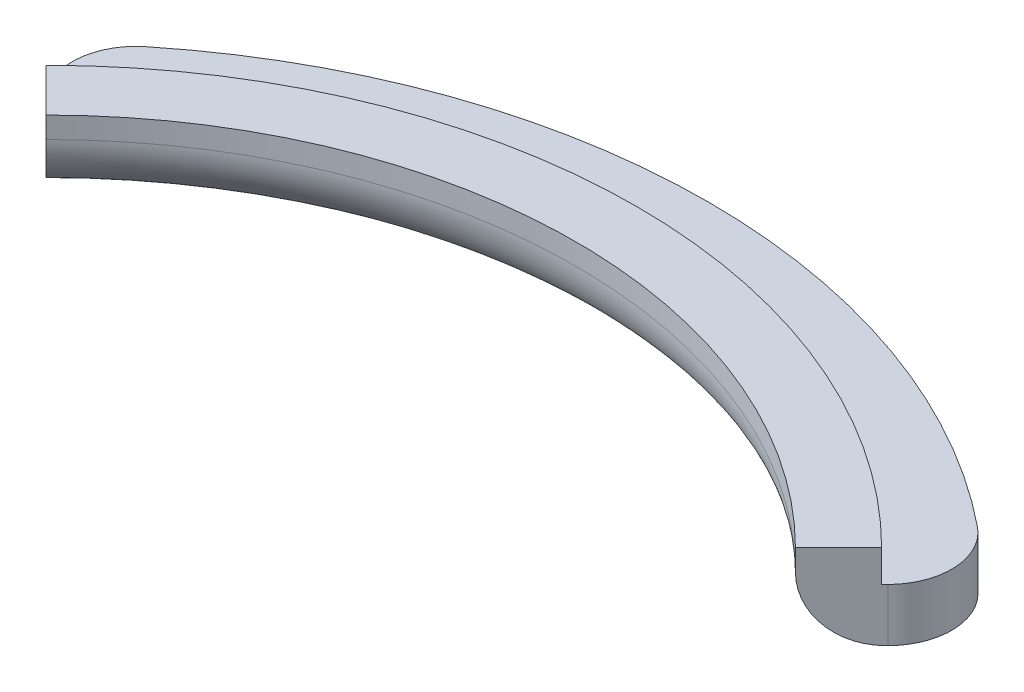
ISO-10303-21;
HEADER;
FILE_DESCRIPTION(('STEP AP214'),'2;1');
FILE_NAME('part.step','',(''),(''),'','','');
FILE_SCHEMA(('AUTOMOTIVE_DESIGN { 1 0 10303 214 1 1 1 1 }'));
ENDSEC;
DATA;
#1=APPLICATION_CONTEXT('core data for automotive mechanical design processes');
#2=APPLICATION_PROTOCOL_DEFINITION('international standard','automotive_design',2000,#1);
#3=PRODUCT_CONTEXT('',#1,'mechanical');
#4=PRODUCT('Part','Part','',(#3));
#5=PRODUCT_RELATED_PRODUCT_CATEGORY('part','',(#4));
#6=PRODUCT_DEFINITION_FORMATION('','',#4);
#7=PRODUCT_DEFINITION_CONTEXT('part definition',#1,'design');
#8=PRODUCT_DEFINITION('design','',#6,#7);
#9=PRODUCT_DEFINITION_SHAPE('','',#8);
#10=(LENGTH_UNIT() NAMED_UNIT(*) SI_UNIT(.MILLI.,.METRE.));
#11=(NAMED_UNIT(*) PLANE_ANGLE_UNIT() SI_UNIT($,.RADIAN.));
#12=(NAMED_UNIT(*) SI_UNIT($,.STERADIAN.) SOLID_ANGLE_UNIT());
#13=UNCERTAINTY_MEASURE_WITH_UNIT(LENGTH_MEASURE(1.E-05),#10,'distance_accuracy_value','');
#14=(GEOMETRIC_REPRESENTATION_CONTEXT(3) GLOBAL_UNCERTAINTY_ASSIGNED_CONTEXT((#13)) GLOBAL_UNIT_ASSIGNED_CONTEXT((#10,
#11,#12)) REPRESENTATION_CONTEXT('',''));
#15=CARTESIAN_POINT('',(0.,0.,0.));
#16=DIRECTION('',(0.,0.,1.));
#17=DIRECTION('',(1.,0.,0.));
#18=AXIS2_PLACEMENT_3D('',#15,#16,#17);
#19=CARTESIAN_POINT('',(0.,2.032,0.));
#20=DIRECTION('',(0.,-1.,0.));
#21=DIRECTION('',(0.,0.,-1.));
#22=AXIS2_PLACEMENT_3D('',#19,#20,#21);
#23=CYLINDRICAL_SURFACE('',#22,12.7);
#24=DIRECTION('',(0.,-1.,0.));
#25=VECTOR('',#24,1.);
#26=CARTESIAN_POINT('',(-8.98025612106917,2.032,-8.98025612106914));
#27=LINE('',#26,#25);
#28=CARTESIAN_POINT('',(-8.98025612106917,2.032,-8.98025612106914));
#29=VERTEX_POINT('',#28);
#30=CARTESIAN_POINT('',(-8.98025612106917,1.524,-8.98025612106914));
#31=VERTEX_POINT('',#30);
#32=EDGE_CURVE('E156',#29,#31,#27,.T.);
#33=ORIENTED_EDGE('',*,*,#32,.T.);
#34=CARTESIAN_POINT('',(0.,1.524,0.));
#35=DIRECTION('',(0.,1.,0.));
#36=DIRECTION('',(0.,0.,1.));
#37=AXIS2_PLACEMENT_3D('',#34,#35,#36);
#38=CIRCLE('',#37,12.7);
#39=CARTESIAN_POINT('',(8.98025612106917,1.524,-8.98025612106914));
#40=VERTEX_POINT('',#39);
#41=EDGE_CURVE('E172',#31,#40,#38,.F.);
#42=ORIENTED_EDGE('',*,*,#41,.T.);
#43=DIRECTION('',(0.,-1.,0.));
#44=VECTOR('',#43,1.);
#45=CARTESIAN_POINT('',(8.98025612106917,2.032,-8.98025612106914));
#46=LINE('',#45,#44);
#47=CARTESIAN_POINT('',(8.98025612106917,2.032,-8.98025612106914));
#48=VERTEX_POINT('',#47);
#49=EDGE_CURVE('E168',#48,#40,#46,.T.);
#50=ORIENTED_EDGE('',*,*,#49,.F.);
#51=CARTESIAN_POINT('',(0.,2.032,0.));
#52=DIRECTION('',(0.,-1.,0.));
#53=DIRECTION('',(0.,0.,1.));
#54=AXIS2_PLACEMENT_3D('',#51,#52,#53);
#55=CIRCLE('',#54,12.7);
#56=EDGE_CURVE('E145',#29,#48,#55,.T.);
#57=ORIENTED_EDGE('',*,*,#56,.F.);
#58=EDGE_LOOP('',(#33,#42,#50,#57));
#59=FACE_BOUND('',#58,.T.);
#60=ADVANCED_FACE('F39',(#59),#23,.F.);
#61=CARTESIAN_POINT('',(8.98025612106917,2.032,-8.98025612106914));
#62=DIRECTION('',(-0.707106781186546,0.,-0.707106781186549));
#63=DIRECTION('',(-0.707106781186549,0.,0.707106781186546));
#64=AXIS2_PLACEMENT_3D('',#61,#62,#63);
#65=PLANE('',#64);
#66=DIRECTION('',(0.707106781186549,0.,-0.707106781186546));
#67=VECTOR('',#66,1.);
#68=CARTESIAN_POINT('',(8.98025612106917,0.,-8.98025612106914));
#69=LINE('',#68,#67);
#70=CARTESIAN_POINT('',(10.0578868555975,0.,-10.0578868555974));
#71=VERTEX_POINT('',#70);
#72=CARTESIAN_POINT('',(10.0903078496149,0.,-10.0903078496149));
#73=VERTEX_POINT('',#72);
#74=EDGE_CURVE('E143',#71,#73,#69,.T.);
#75=ORIENTED_EDGE('',*,*,#74,.T.);
#76=DIRECTION('',(0.,-1.,0.));
#77=VECTOR('',#76,1.);
#78=CARTESIAN_POINT('',(10.0903078496149,2.032,-10.0903078496149));
#79=LINE('',#78,#77);
#80=CARTESIAN_POINT('',(10.0903078496149,1.27,-10.0903078496149));
#81=VERTEX_POINT('',#80);
#82=EDGE_CURVE('E63',#73,#81,#79,.F.);
#83=ORIENTED_EDGE('',*,*,#82,.T.);
#84=DIRECTION('',(0.707106781186549,0.,-0.707106781186546));
#85=VECTOR('',#84,1.);
#86=CARTESIAN_POINT('',(10.0129855749921,1.27,-10.0129855749921));
#87=LINE('',#86,#85);
#88=CARTESIAN_POINT('',(10.0129855749921,1.27,-10.0129855749921));
#89=VERTEX_POINT('',#88);
#90=EDGE_CURVE('E127',#89,#81,#87,.T.);
#91=ORIENTED_EDGE('',*,*,#90,.F.);
#92=DIRECTION('',(0.,1.,0.));
#93=VECTOR('',#92,1.);
#94=CARTESIAN_POINT('',(10.0129855749921,1.27,-10.0129855749921));
#95=LINE('',#94,#93);
#96=CARTESIAN_POINT('',(10.0129855749921,2.032,-10.0129855749921));
#97=VERTEX_POINT('',#96);
#98=EDGE_CURVE('E114',#89,#97,#95,.T.);
#99=ORIENTED_EDGE('',*,*,#98,.T.);
#100=DIRECTION('',(0.707106781186549,0.,-0.707106781186546));
#101=VECTOR('',#100,1.);
#102=CARTESIAN_POINT('',(8.98025612106917,2.032,-8.98025612106914));
#103=LINE('',#102,#101);
#104=EDGE_CURVE('E149',#48,#97,#103,.T.);
#105=ORIENTED_EDGE('',*,*,#104,.F.);
#106=ORIENTED_EDGE('',*,*,#49,.T.);
#107=CARTESIAN_POINT('',(10.0578868555975,1.524,-10.0578868555974));
#108=DIRECTION('',(-0.707106781186546,0.,-0.707106781186549));
#109=DIRECTION('',(-0.707106781186549,0.,0.707106781186546));
#110=AXIS2_PLACEMENT_3D('',#107,#108,#109);
#111=CIRCLE('',#110,1.524);
#112=EDGE_CURVE('E176',#40,#71,#111,.F.);
#113=ORIENTED_EDGE('',*,*,#112,.T.);
#114=EDGE_LOOP('',(#75,#83,#91,#99,#105,#106,#113));
#115=FACE_BOUND('',#114,.T.);
#116=ADVANCED_FACE('F131',(#115),#65,.F.);
#117=CARTESIAN_POINT('',(0.,2.032,0.));
#118=DIRECTION('',(0.,-1.,0.));
#119=DIRECTION('',(0.,0.,-1.));
#120=AXIS2_PLACEMENT_3D('',#117,#118,#119);
#121=CYLINDRICAL_SURFACE('',#120,15.875);
#122=CARTESIAN_POINT('',(0.,1.27,0.));
#123=DIRECTION('',(0.,1.,0.));
#124=DIRECTION('',(0.,0.,1.));
#125=AXIS2_PLACEMENT_3D('',#122,#123,#124);
#126=CIRCLE('',#125,15.875);
#127=CARTESIAN_POINT('',(9.96977556978608,1.27,-12.3539143629902));
#128=VERTEX_POINT('',#127);
#129=CARTESIAN_POINT('',(-9.96977556978608,1.27,-12.3539143629902));
#130=VERTEX_POINT('',#129);
#131=EDGE_CURVE('E133',#128,#130,#126,.T.);
#132=ORIENTED_EDGE('',*,*,#131,.F.);
#133=DIRECTION('',(0.,-1.,0.));
#134=VECTOR('',#133,1.);
#135=CARTESIAN_POINT('',(9.96977556978608,2.032,-12.3539143629902));
#136=LINE('',#135,#134);
#137=CARTESIAN_POINT('',(9.96977556978608,0.,-12.3539143629902));
#138=VERTEX_POINT('',#137);
#139=EDGE_CURVE('E189',#128,#138,#136,.T.);
#140=ORIENTED_EDGE('',*,*,#139,.T.);
#141=CARTESIAN_POINT('',(0.,0.,0.));
#142=DIRECTION('',(0.,1.,0.));
#143=DIRECTION('',(0.,0.,1.));
#144=AXIS2_PLACEMENT_3D('',#141,#142,#143);
#145=CIRCLE('',#144,15.875);
#146=CARTESIAN_POINT('',(-9.96977556978608,0.,-12.3539143629902));
#147=VERTEX_POINT('',#146);
#148=EDGE_CURVE('E159',#138,#147,#145,.T.);
#149=ORIENTED_EDGE('',*,*,#148,.T.);
#150=DIRECTION('',(0.,-1.,0.));
#151=VECTOR('',#150,1.);
#152=CARTESIAN_POINT('',(-9.96977556978608,2.032,-12.3539143629902));
#153=LINE('',#152,#151);
#154=EDGE_CURVE('E186',#147,#130,#153,.F.);
#155=ORIENTED_EDGE('',*,*,#154,.T.);
#156=EDGE_LOOP('',(#132,#140,#149,#155));
#157=FACE_BOUND('',#156,.T.);
#158=ADVANCED_FACE('F207',(#157),#121,.T.);
#159=CARTESIAN_POINT('',(-8.98025612106917,2.032,-8.98025612106914));
#160=DIRECTION('',(0.707106781186546,0.,-0.707106781186549));
#161=DIRECTION('',(-0.707106781186549,0.,-0.707106781186546));
#162=AXIS2_PLACEMENT_3D('',#159,#160,#161);
#163=PLANE('',#162);
#164=DIRECTION('',(0.707106781186549,0.,0.707106781186547));
#165=VECTOR('',#164,1.);
#166=CARTESIAN_POINT('',(-11.2253201513365,1.27,-11.2253201513364));
#167=LINE('',#166,#165);
#168=CARTESIAN_POINT('',(-10.0903078496149,1.27,-10.0903078496149));
#169=VERTEX_POINT('',#168);
#170=CARTESIAN_POINT('',(-10.0129855749921,1.27,-10.0129855749921));
#171=VERTEX_POINT('',#170);
#172=EDGE_CURVE('E124',#169,#171,#167,.T.);
#173=ORIENTED_EDGE('',*,*,#172,.F.);
#174=DIRECTION('',(0.,-1.,0.));
#175=VECTOR('',#174,1.);
#176=CARTESIAN_POINT('',(-10.0903078496149,2.032,-10.0903078496149));
#177=LINE('',#176,#175);
#178=CARTESIAN_POINT('',(-10.0903078496149,0.,-10.0903078496149));
#179=VERTEX_POINT('',#178);
#180=EDGE_CURVE('E11',#169,#179,#177,.T.);
#181=ORIENTED_EDGE('',*,*,#180,.T.);
#182=DIRECTION('',(0.707106781186549,0.,0.707106781186546));
#183=VECTOR('',#182,1.);
#184=CARTESIAN_POINT('',(-8.98025612106917,0.,-8.98025612106914));
#185=LINE('',#184,#183);
#186=CARTESIAN_POINT('',(-10.0578868555975,0.,-10.0578868555974));
#187=VERTEX_POINT('',#186);
#188=EDGE_CURVE('E150',#179,#187,#185,.T.);
#189=ORIENTED_EDGE('',*,*,#188,.T.);
#190=CARTESIAN_POINT('',(-10.0578868555975,1.524,-10.0578868555974));
#191=DIRECTION('',(0.707106781186546,0.,-0.707106781186549));
#192=DIRECTION('',(-0.707106781186549,0.,-0.707106781186546));
#193=AXIS2_PLACEMENT_3D('',#190,#191,#192);
#194=CIRCLE('',#193,1.524);
#195=EDGE_CURVE('E183',#187,#31,#194,.F.);
#196=ORIENTED_EDGE('',*,*,#195,.T.);
#197=ORIENTED_EDGE('',*,*,#32,.F.);
#198=DIRECTION('',(0.707106781186549,0.,0.707106781186546));
#199=VECTOR('',#198,1.);
#200=CARTESIAN_POINT('',(-8.98025612106917,2.032,-8.98025612106914));
#201=LINE('',#200,#199);
#202=CARTESIAN_POINT('',(-10.0129855749921,2.032,-10.0129855749921));
#203=VERTEX_POINT('',#202);
#204=EDGE_CURVE('E153',#203,#29,#201,.T.);
#205=ORIENTED_EDGE('',*,*,#204,.F.);
#206=DIRECTION('',(0.,1.,0.));
#207=VECTOR('',#206,1.);
#208=CARTESIAN_POINT('',(-10.0129855749921,1.27,-10.0129855749921));
#209=LINE('',#208,#207);
#210=EDGE_CURVE('E123',#171,#203,#209,.T.);
#211=ORIENTED_EDGE('',*,*,#210,.F.);
#212=EDGE_LOOP('',(#173,#181,#189,#196,#197,#205,#211));
#213=FACE_BOUND('',#212,.T.);
#214=ADVANCED_FACE('F225',(#213),#163,.F.);
#215=CARTESIAN_POINT('',(0.,2.032,0.));
#216=DIRECTION('',(0.,1.,0.));
#217=DIRECTION('',(0.,0.,1.));
#218=AXIS2_PLACEMENT_3D('',#215,#216,#217);
#219=PLANE('',#218);
#220=CARTESIAN_POINT('',(0.,2.032,0.));
#221=DIRECTION('',(0.,-1.,0.));
#222=DIRECTION('',(0.,0.,-1.));
#223=AXIS2_PLACEMENT_3D('',#220,#221,#222);
#224=CIRCLE('',#223,14.1605);
#225=EDGE_CURVE('E120',#203,#97,#224,.T.);
#226=ORIENTED_EDGE('',*,*,#225,.F.);
#227=ORIENTED_EDGE('',*,*,#204,.T.);
#228=ORIENTED_EDGE('',*,*,#56,.T.);
#229=ORIENTED_EDGE('',*,*,#104,.T.);
#230=EDGE_LOOP('',(#226,#227,#228,#229));
#231=FACE_BOUND('',#230,.T.);
#232=ADVANCED_FACE('F251',(#231),#219,.T.);
#233=CARTESIAN_POINT('',(0.,0.,0.));
#234=DIRECTION('',(0.,1.,0.));
#235=DIRECTION('',(0.,0.,1.));
#236=AXIS2_PLACEMENT_3D('',#233,#234,#235);
#237=PLANE('',#236);
#238=ORIENTED_EDGE('',*,*,#148,.F.);
#239=CARTESIAN_POINT('',(9.01267711508662,0.,-11.1679385841432));
#240=DIRECTION('',(0.,1.,0.));
#241=DIRECTION('',(0.,0.,1.));
#242=AXIS2_PLACEMENT_3D('',#239,#240,#241);
#243=CIRCLE('',#242,1.524);
#244=EDGE_CURVE('E196',#138,#73,#243,.F.);
#245=ORIENTED_EDGE('',*,*,#244,.T.);
#246=ORIENTED_EDGE('',*,*,#74,.F.);
#247=CARTESIAN_POINT('',(0.,0.,0.));
#248=DIRECTION('',(0.,1.,0.));
#249=DIRECTION('',(0.,0.,1.));
#250=AXIS2_PLACEMENT_3D('',#247,#248,#249);
#251=CIRCLE('',#250,14.224);
#252=EDGE_CURVE('E179',#71,#187,#251,.T.);
#253=ORIENTED_EDGE('',*,*,#252,.T.);
#254=ORIENTED_EDGE('',*,*,#188,.F.);
#255=CARTESIAN_POINT('',(-9.01267711508662,0.,-11.1679385841432));
#256=DIRECTION('',(0.,1.,0.));
#257=DIRECTION('',(0.,0.,1.));
#258=AXIS2_PLACEMENT_3D('',#255,#256,#257);
#259=CIRCLE('',#258,1.524);
#260=EDGE_CURVE('E193',#179,#147,#259,.F.);
#261=ORIENTED_EDGE('',*,*,#260,.T.);
#262=EDGE_LOOP('',(#238,#245,#246,#253,#254,#261));
#263=FACE_BOUND('',#262,.T.);
#264=ADVANCED_FACE('F213',(#263),#237,.F.);
#265=CARTESIAN_POINT('',(0.,1.27,0.));
#266=DIRECTION('',(0.,1.,0.));
#267=DIRECTION('',(0.,0.,1.));
#268=AXIS2_PLACEMENT_3D('',#265,#266,#267);
#269=CYLINDRICAL_SURFACE('',#268,14.1605);
#270=ORIENTED_EDGE('',*,*,#225,.T.);
#271=ORIENTED_EDGE('',*,*,#98,.F.);
#272=CARTESIAN_POINT('',(0.,1.27,0.));
#273=DIRECTION('',(0.,-1.,0.));
#274=DIRECTION('',(0.,0.,-1.));
#275=AXIS2_PLACEMENT_3D('',#272,#273,#274);
#276=CIRCLE('',#275,14.1605);
#277=EDGE_CURVE('E117',#171,#89,#276,.T.);
#278=ORIENTED_EDGE('',*,*,#277,.F.);
#279=ORIENTED_EDGE('',*,*,#210,.T.);
#280=EDGE_LOOP('',(#270,#271,#278,#279));
#281=FACE_BOUND('',#280,.T.);
#282=ADVANCED_FACE('F116',(#281),#269,.T.);
#283=CARTESIAN_POINT('',(0.,1.27,0.));
#284=DIRECTION('',(0.,-1.,0.));
#285=DIRECTION('',(0.,0.,-1.));
#286=AXIS2_PLACEMENT_3D('',#283,#284,#285);
#287=PLANE('',#286);
#288=ORIENTED_EDGE('',*,*,#90,.T.);
#289=CARTESIAN_POINT('',(9.01267711508662,1.27,-11.1679385841432));
#290=DIRECTION('',(0.,-1.,0.));
#291=DIRECTION('',(0.,0.,-1.));
#292=AXIS2_PLACEMENT_3D('',#289,#290,#291);
#293=CIRCLE('',#292,1.524);
#294=EDGE_CURVE('E48',#81,#128,#293,.F.);
#295=ORIENTED_EDGE('',*,*,#294,.T.);
#296=ORIENTED_EDGE('',*,*,#131,.T.);
#297=CARTESIAN_POINT('',(-9.01267711508662,1.27,-11.1679385841432));
#298=DIRECTION('',(0.,-1.,0.));
#299=DIRECTION('',(0.,0.,-1.));
#300=AXIS2_PLACEMENT_3D('',#297,#298,#299);
#301=CIRCLE('',#300,1.524);
#302=EDGE_CURVE('E55',#130,#169,#301,.F.);
#303=ORIENTED_EDGE('',*,*,#302,.T.);
#304=ORIENTED_EDGE('',*,*,#172,.T.);
#305=ORIENTED_EDGE('',*,*,#277,.T.);
#306=EDGE_LOOP('',(#288,#295,#296,#303,#304,#305));
#307=FACE_BOUND('',#306,.T.);
#308=ADVANCED_FACE('F126',(#307),#287,.F.);
#309=CARTESIAN_POINT('',(0.,1.524,0.));
#310=DIRECTION('',(0.,1.,0.));
#311=DIRECTION('',(0.,0.,1.));
#312=AXIS2_PLACEMENT_3D('',#309,#310,#311);
#313=TOROIDAL_SURFACE('',#312,14.224,1.524);
#314=ORIENTED_EDGE('',*,*,#195,.F.);
#315=ORIENTED_EDGE('',*,*,#252,.F.);
#316=ORIENTED_EDGE('',*,*,#112,.F.);
#317=ORIENTED_EDGE('',*,*,#41,.F.);
#318=EDGE_LOOP('',(#314,#315,#316,#317));
#319=FACE_BOUND('',#318,.T.);
#320=ADVANCED_FACE('F219',(#319),#313,.T.);
#321=CARTESIAN_POINT('',(9.01267711508662,2.032,-11.1679385841432));
#322=DIRECTION('',(0.,-1.,0.));
#323=DIRECTION('',(0.,0.,-1.));
#324=AXIS2_PLACEMENT_3D('',#321,#322,#323);
#325=CYLINDRICAL_SURFACE('',#324,1.524);
#326=ORIENTED_EDGE('',*,*,#294,.F.);
#327=ORIENTED_EDGE('',*,*,#82,.F.);
#328=ORIENTED_EDGE('',*,*,#244,.F.);
#329=ORIENTED_EDGE('',*,*,#139,.F.);
#330=EDGE_LOOP('',(#326,#327,#328,#329));
#331=FACE_BOUND('',#330,.T.);
#332=ADVANCED_FACE('F210',(#331),#325,.T.);
#333=CARTESIAN_POINT('',(-9.01267711508662,2.032,-11.1679385841432));
#334=DIRECTION('',(0.,-1.,0.));
#335=DIRECTION('',(0.,0.,-1.));
#336=AXIS2_PLACEMENT_3D('',#333,#334,#335);
#337=CYLINDRICAL_SURFACE('',#336,1.524);
#338=ORIENTED_EDGE('',*,*,#302,.F.);
#339=ORIENTED_EDGE('',*,*,#154,.F.);
#340=ORIENTED_EDGE('',*,*,#260,.F.);
#341=ORIENTED_EDGE('',*,*,#180,.F.);
#342=EDGE_LOOP('',(#338,#339,#340,#341));
#343=FACE_BOUND('',#342,.T.);
#344=ADVANCED_FACE('F41',(#343),#337,.T.);
#345=CLOSED_SHELL('',(#60,#116,#158,#214,#232,#264,#282,#308,#320,#332,#344));
#346=MANIFOLD_SOLID_BREP('B2',#345);
#347=ADVANCED_BREP_SHAPE_REPRESENTATION('',(#18,#346),#14);
#348=SHAPE_DEFINITION_REPRESENTATION(#9,#347);
ENDSEC;
END-ISO-10303-21;
